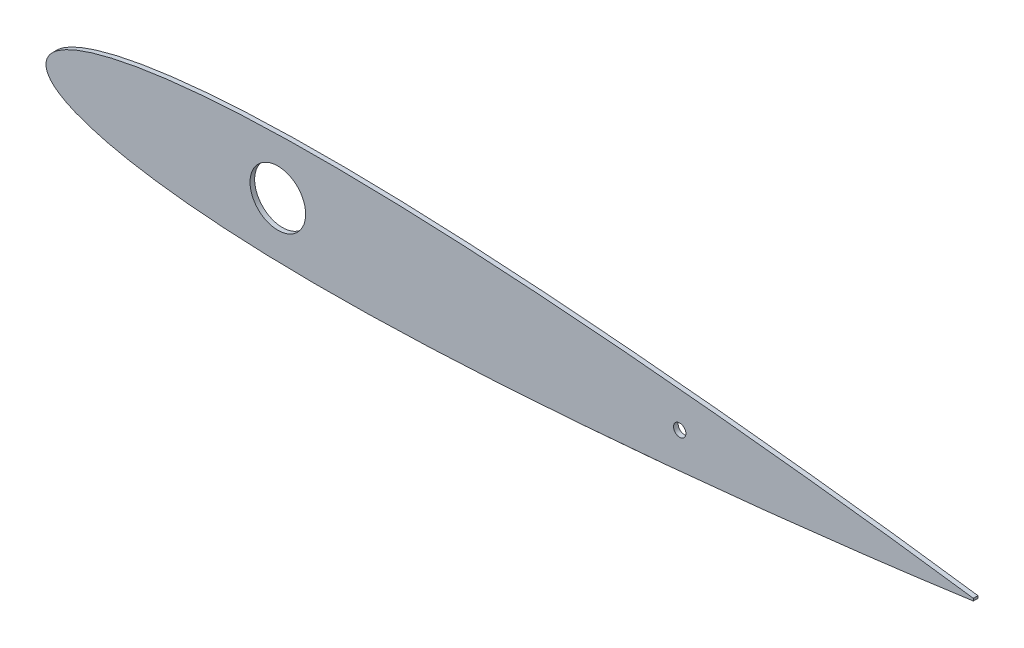
ISO-10303-21;
HEADER;
FILE_DESCRIPTION(('STEP AP214'),'2;1');
FILE_NAME('part.step','',(''),(''),'','','');
FILE_SCHEMA(('AUTOMOTIVE_DESIGN { 1 0 10303 214 1 1 1 1 }'));
ENDSEC;
DATA;
#1=APPLICATION_CONTEXT('core data for automotive mechanical design processes');
#2=APPLICATION_PROTOCOL_DEFINITION('international standard','automotive_design',2000,#1);
#3=PRODUCT_CONTEXT('',#1,'mechanical');
#4=PRODUCT('Part','Part','',(#3));
#5=PRODUCT_RELATED_PRODUCT_CATEGORY('part','',(#4));
#6=PRODUCT_DEFINITION_FORMATION('','',#4);
#7=PRODUCT_DEFINITION_CONTEXT('part definition',#1,'design');
#8=PRODUCT_DEFINITION('design','',#6,#7);
#9=PRODUCT_DEFINITION_SHAPE('','',#8);
#10=(LENGTH_UNIT() NAMED_UNIT(*) SI_UNIT(.MILLI.,.METRE.));
#11=(NAMED_UNIT(*) PLANE_ANGLE_UNIT() SI_UNIT($,.RADIAN.));
#12=(NAMED_UNIT(*) SI_UNIT($,.STERADIAN.) SOLID_ANGLE_UNIT());
#13=UNCERTAINTY_MEASURE_WITH_UNIT(LENGTH_MEASURE(1.E-05),#10,'distance_accuracy_value','');
#14=(GEOMETRIC_REPRESENTATION_CONTEXT(3) GLOBAL_UNCERTAINTY_ASSIGNED_CONTEXT((#13)) GLOBAL_UNIT_ASSIGNED_CONTEXT((#10,
#11,#12)) REPRESENTATION_CONTEXT('',''));
#15=CARTESIAN_POINT('',(0.,0.,0.));
#16=DIRECTION('',(0.,0.,1.));
#17=DIRECTION('',(1.,0.,0.));
#18=AXIS2_PLACEMENT_3D('',#15,#16,#17);
#19=CARTESIAN_POINT('',(300.,0.378,1.5));
#20=CARTESIAN_POINT('',(299.270406423723,0.479445821702321,1.5));
#21=CARTESIAN_POINT('',(297.234667094079,0.762503753929655,1.5));
#22=CARTESIAN_POINT('',(293.659650160598,1.25767350567564,1.5));
#23=CARTESIAN_POINT('',(289.112411794917,1.87424244263317,1.5));
#24=CARTESIAN_POINT('',(284.080816659039,2.54451744035542,1.5));
#25=CARTESIAN_POINT('',(278.752044218457,3.23812231587756,1.5));
#26=CARTESIAN_POINT('',(273.265899022492,3.93494643569603,1.5));
#27=CARTESIAN_POINT('',(267.705955472008,4.62901994283452,1.5));
#28=CARTESIAN_POINT('',(262.114563019878,5.31306910693868,1.5));
#29=CARTESIAN_POINT('',(256.508348909458,5.98219181245687,1.5));
#30=CARTESIAN_POINT('',(250.891738994323,6.63799080906206,1.5));
#31=CARTESIAN_POINT('',(245.269556965141,7.28177923500822,1.5));
#32=CARTESIAN_POINT('',(239.647345348642,7.91223276352409,1.5));
#33=CARTESIAN_POINT('',(234.025130106878,8.52699204615673,1.5));
#34=CARTESIAN_POINT('',(228.399087902931,9.12622976388424,1.5));
#35=CARTESIAN_POINT('',(222.76825764507,9.71307760610579,1.5));
#36=CARTESIAN_POINT('',(217.135920793231,10.2874598097057,1.5));
#37=CARTESIAN_POINT('',(211.505410154051,10.8469410839575,1.5));
#38=CARTESIAN_POINT('',(205.877619803237,11.3916428267252,1.5));
#39=CARTESIAN_POINT('',(200.251512373849,11.9208846239163,1.5));
#40=CARTESIAN_POINT('',(194.626420536409,12.4346170780367,1.5));
#41=CARTESIAN_POINT('',(189.002797137157,12.9319118094686,1.5));
#42=CARTESIAN_POINT('',(183.381530937822,13.4130975813696,1.5));
#43=CARTESIAN_POINT('',(177.763225616091,13.8763767009773,1.5));
#44=CARTESIAN_POINT('',(172.148301533052,14.3212371935345,1.5));
#45=CARTESIAN_POINT('',(166.537529461529,14.7478209184035,1.5));
#46=CARTESIAN_POINT('',(160.931736194082,15.1542281440202,1.5));
#47=CARTESIAN_POINT('',(155.331708850266,15.5391008558727,1.5));
#48=CARTESIAN_POINT('',(149.737538344952,15.9026495636587,1.5));
#49=CARTESIAN_POINT('',(144.148688279318,16.241846118568,1.5));
#50=CARTESIAN_POINT('',(138.565679604284,16.5574205464223,1.5));
#51=CARTESIAN_POINT('',(132.990859803018,16.8473975552547,1.5));
#52=CARTESIAN_POINT('',(127.427439440236,17.1102116785312,1.5));
#53=CARTESIAN_POINT('',(121.877619637439,17.3438917175145,1.5));
#54=CARTESIAN_POINT('',(116.340758577333,17.5452568128182,1.5));
#55=CARTESIAN_POINT('',(110.815476382379,17.712679119923,1.5));
#56=CARTESIAN_POINT('',(105.301273398415,17.8444979379819,1.5));
#57=CARTESIAN_POINT('',(99.8005701155126,17.9400918128776,1.5));
#58=CARTESIAN_POINT('',(94.3174358437247,17.9965904385618,1.5));
#59=CARTESIAN_POINT('',(88.8557640671298,18.0101244579531,1.5));
#60=CARTESIAN_POINT('',(83.4186479748791,17.9792338403315,1.5));
#61=CARTESIAN_POINT('',(78.0084808270908,17.8991607130085,1.5));
#62=CARTESIAN_POINT('',(72.6284553647751,17.7670337872511,1.5));
#63=CARTESIAN_POINT('',(67.2827387457577,17.5794139337101,1.5));
#64=CARTESIAN_POINT('',(61.9773648945375,17.331515488689,1.5));
#65=CARTESIAN_POINT('',(56.7206910156783,17.0210326511062,1.5));
#66=CARTESIAN_POINT('',(51.5251753215055,16.6409580698619,1.5));
#67=CARTESIAN_POINT('',(46.4082026187076,16.1901885907441,1.5));
#68=CARTESIAN_POINT('',(41.3941760651905,15.6616690993154,1.5));
#69=CARTESIAN_POINT('',(36.5156710865437,15.0539637839737,1.5));
#70=CARTESIAN_POINT('',(31.8190094409283,14.3656236049764,1.5));
#71=CARTESIAN_POINT('',(27.3661648285309,13.6034756838757,1.5));
#72=CARTESIAN_POINT('',(23.2352179540624,12.7825834438859,1.5));
#73=CARTESIAN_POINT('',(19.5026424507863,11.9202507512816,1.5));
#74=CARTESIAN_POINT('',(16.2182713927649,11.0445977962822,1.5));
#75=CARTESIAN_POINT('',(13.3891860155784,10.1750762553965,1.5));
#76=CARTESIAN_POINT('',(10.9849293334544,9.33349871540906,1.5));
#77=CARTESIAN_POINT('',(8.96156147750924,8.52206288153796,1.5));
#78=CARTESIAN_POINT('',(7.26729205281864,7.74697600174495,1.5));
#79=CARTESIAN_POINT('',(5.84605246563954,7.01062562176008,1.5));
#80=CARTESIAN_POINT('',(4.64771108498271,6.30063403293287,1.5));
#81=CARTESIAN_POINT('',(3.62823525123192,5.60651366797511,1.5));
#82=CARTESIAN_POINT('',(2.75190919699738,4.92663525162572,1.5));
#83=CARTESIAN_POINT('',(2.0062573601689,4.24991725904032,1.5));
#84=CARTESIAN_POINT('',(1.39058613668709,3.570259491991,1.5));
#85=CARTESIAN_POINT('',(0.901000434809516,2.89094225228363,1.5));
#86=CARTESIAN_POINT('',(0.529275534924718,2.22021927340558,1.5));
#87=CARTESIAN_POINT('',(0.260479536936117,1.56645893590234,1.5));
#88=CARTESIAN_POINT('',(0.0857126538537306,0.931035928118987,1.5));
#89=CARTESIAN_POINT('',(-0.00350924718492415,0.308981014512189,1.5));
#90=CARTESIAN_POINT('',(-0.00350924718492199,-0.308981014512209,1.5));
#91=CARTESIAN_POINT('',(0.0857126538537279,-0.931035928118965,1.5));
#92=CARTESIAN_POINT('',(0.260479536936107,-1.56645893590232,1.5));
#93=CARTESIAN_POINT('',(0.529275534924743,-2.2202192734056,1.5));
#94=CARTESIAN_POINT('',(0.901000434809474,-2.89094225228368,1.5));
#95=CARTESIAN_POINT('',(1.39058613668717,-3.57025949199063,1.5));
#96=CARTESIAN_POINT('',(2.00625736016862,-4.24991725904197,1.5));
#97=CARTESIAN_POINT('',(2.75190919699857,-4.92663525161857,1.5));
#98=CARTESIAN_POINT('',(3.62823525122678,-5.60651366800603,1.5));
#99=CARTESIAN_POINT('',(4.6477110850053,-6.3006340327972,1.5));
#100=CARTESIAN_POINT('',(5.84605246553727,-7.01062562237321,1.5));
#101=CARTESIAN_POINT('',(7.26729205329404,-7.74697599889616,1.5));
#102=CARTESIAN_POINT('',(8.96156147525896,-8.5220628950217,1.5));
#103=CARTESIAN_POINT('',(10.9849293441544,-9.33349865129378,1.5));
#104=CARTESIAN_POINT('',(13.3891859649807,-10.1750765585832,1.5));
#105=CARTESIAN_POINT('',(16.218271629693,-11.0445963765829,1.5));
#106=CARTESIAN_POINT('',(19.5026413612413,-11.9202572799561,1.5));
#107=CARTESIAN_POINT('',(23.2352227989104,-12.78255441302,1.5));
#108=CARTESIAN_POINT('',(27.3661275586072,-13.6035961608478,1.5));
#109=CARTESIAN_POINT('',(31.8190750083372,-14.3651133634918,1.5));
#110=CARTESIAN_POINT('',(36.5156346373272,-15.0541060972868,1.5));
#111=CARTESIAN_POINT('',(41.3941822041013,-15.6616288870965,1.5));
#112=CARTESIAN_POINT('',(46.4082009236496,-16.1901996940233,1.5));
#113=CARTESIAN_POINT('',(51.5251757859908,-16.6409550273053,1.5));
#114=CARTESIAN_POINT('',(56.7206908890808,-17.0210334803687,1.5));
#115=CARTESIAN_POINT('',(61.9773649289189,-17.3315152634777,1.5));
#116=CARTESIAN_POINT('',(67.2827387364428,-17.5794139947263,1.5));
#117=CARTESIAN_POINT('',(72.6284553672946,-17.767033770747,1.5));
#118=CARTESIAN_POINT('',(78.0084808264101,-17.8991607174675,1.5));
#119=CARTESIAN_POINT('',(83.4186479750628,-17.9792338391277,1.5));
#120=CARTESIAN_POINT('',(88.8557640670803,-18.0101244582778,1.5));
#121=CARTESIAN_POINT('',(94.317435843738,-17.9965904384742,1.5));
#122=CARTESIAN_POINT('',(99.8005701155091,-17.9400918129012,1.5));
#123=CARTESIAN_POINT('',(105.301273398416,-17.8444979379756,1.5));
#124=CARTESIAN_POINT('',(110.815476382379,-17.7126791199247,1.5));
#125=CARTESIAN_POINT('',(116.340758577333,-17.5452568128177,1.5));
#126=CARTESIAN_POINT('',(121.877619637439,-17.3438917175146,1.5));
#127=CARTESIAN_POINT('',(127.427439440236,-17.1102116785312,1.5));
#128=CARTESIAN_POINT('',(132.990859803018,-16.8473975552547,1.5));
#129=CARTESIAN_POINT('',(138.565679604284,-16.5574205464223,1.5));
#130=CARTESIAN_POINT('',(144.148688279318,-16.241846118568,1.5));
#131=CARTESIAN_POINT('',(149.737538344952,-15.9026495636587,1.5));
#132=CARTESIAN_POINT('',(155.331708850266,-15.5391008558727,1.5));
#133=CARTESIAN_POINT('',(160.931736194082,-15.1542281440202,1.5));
#134=CARTESIAN_POINT('',(166.537529461529,-14.7478209184035,1.5));
#135=CARTESIAN_POINT('',(172.148301533052,-14.3212371935345,1.5));
#136=CARTESIAN_POINT('',(177.763225616091,-13.8763767009773,1.5));
#137=CARTESIAN_POINT('',(183.381530937822,-13.4130975813696,1.5));
#138=CARTESIAN_POINT('',(189.002797137156,-12.9319118094686,1.5));
#139=CARTESIAN_POINT('',(194.626420536409,-12.4346170780367,1.5));
#140=CARTESIAN_POINT('',(200.251512373849,-11.9208846239163,1.5));
#141=CARTESIAN_POINT('',(205.877619803237,-11.3916428267251,1.5));
#142=CARTESIAN_POINT('',(211.505410154051,-10.8469410839575,1.5));
#143=CARTESIAN_POINT('',(217.135920793231,-10.2874598097057,1.5));
#144=CARTESIAN_POINT('',(222.76825764507,-9.71307760610578,1.5));
#145=CARTESIAN_POINT('',(228.399087902931,-9.12622976388424,1.5));
#146=CARTESIAN_POINT('',(234.025130106878,-8.52699204615673,1.5));
#147=CARTESIAN_POINT('',(239.647345348642,-7.91223276352409,1.5));
#148=CARTESIAN_POINT('',(245.269556965141,-7.28177923500822,1.5));
#149=CARTESIAN_POINT('',(250.891738994323,-6.63799080906206,1.5));
#150=CARTESIAN_POINT('',(256.508348909458,-5.98219181245686,1.5));
#151=CARTESIAN_POINT('',(262.114563019878,-5.31306910693868,1.5));
#152=CARTESIAN_POINT('',(267.705955472008,-4.62901994283452,1.5));
#153=CARTESIAN_POINT('',(273.265899022492,-3.93494643569603,1.5));
#154=CARTESIAN_POINT('',(278.752044218457,-3.23812231587756,1.5));
#155=CARTESIAN_POINT('',(284.080816659039,-2.54451744035542,1.5));
#156=CARTESIAN_POINT('',(289.112411794917,-1.87424244263317,1.5));
#157=CARTESIAN_POINT('',(293.659650160598,-1.25767350567564,1.5));
#158=CARTESIAN_POINT('',(297.234667094079,-0.76250375392966,1.5));
#159=CARTESIAN_POINT('',(299.270406423723,-0.479445821702321,1.5));
#160=CARTESIAN_POINT('',(300.,-0.378,1.5));
#161=B_SPLINE_CURVE_WITH_KNOTS('',3,(#19,#20,#21,#22,#23,#24,#25,#26,#27,#28,#29,#30,#31,#32,
#33,#34,#35,#36,#37,#38,#39,#40,#41,#42,#43,#44,#45,#46,#47,#48,#49,#50,#51,#52,#53,#54,#55,#56,
#57,#58,#59,#60,#61,#62,#63,#64,#65,#66,#67,#68,#69,#70,#71,#72,#73,#74,#75,#76,#77,#78,#79,#80,
#81,#82,#83,#84,#85,#86,#87,#88,#89,#90,#91,#92,#93,#94,#95,#96,#97,#98,#99,#100,#101,#102,#103,
#104,#105,#106,#107,#108,#109,#110,#111,#112,#113,#114,#115,#116,#117,#118,#119,#120,#121,#122,
#123,#124,#125,#126,#127,#128,#129,#130,#131,#132,#133,#134,#135,#136,#137,#138,#139,#140,#141,
#142,#143,#144,#145,#146,#147,#148,#149,#150,#151,#152,#153,#154,#155,#156,#157,#158,#159,#160),
.UNSPECIFIED.,.F.,.F.,(4,1,1,1,1,1,1,1,1,1,1,1,1,1,1,1,1,1,1,1,1,1,1,1,1,1,1,1,1,1,1,1,1,1,1,1,
1,1,1,1,1,1,1,1,1,1,1,1,1,1,1,1,1,1,1,1,1,1,1,1,1,1,1,1,1,1,1,1,1,1,1,1,1,1,1,1,1,1,1,1,1,1,1,1,
1,1,1,1,1,1,1,1,1,1,1,1,1,1,1,1,1,1,1,1,1,1,1,1,1,1,1,1,1,1,1,1,1,1,1,1,1,1,1,1,1,1,1,1,1,1,1,1,
1,1,1,1,1,1,1,4),(0.,0.00361222059404388,0.0100789532278554,0.0176986181570895,
0.0261151107220122,0.0349709660638799,0.0440503796486832,0.0532343297369713,0.0624475697827881,
0.0716739929600303,0.0809213185094618,0.0901775382979332,0.0994243421366575,0.108664440992277,
0.117912199004999,0.127169502180609,0.136426594565023,0.145675425736823,0.154916495397513,
0.164153236916375,0.173386648526191,0.182615736180586,0.191838089492061,0.201053134496137,
0.210260392550908,0.219458942389608,0.228646746886173,0.237822316287067,0.24698522413025,
0.25613738364592,0.265279415916296,0.274406949966901,0.283512193452554,0.292591781113348,
0.30164628535433,0.310681792653752,0.31969906757785,0.32869451957993,0.337660159695399,
0.346588583205171,0.355477411634764,0.364322937295264,0.373121613643215,0.381867635356829,
0.390553004884712,0.399166025869356,0.407689628257838,0.416098119030288,0.424354887451602,
0.432412428746428,0.440204728485537,0.447630505181733,0.454563637698397,0.460855379429517,
0.466413319364109,0.471228610451128,0.475365774282038,0.478901259753558,0.481915077255184,
0.484498871900912,0.486747127386087,0.488741251833575,0.490543179252672,0.492182103901344,
0.493672830547239,0.495031907807012,0.496279059618418,0.497424736506128,0.498490165528455,
0.499502757789975,0.500497253863142,0.501509846124661,0.502575275146988,0.503720952034698,
0.504968103846104,0.506327181105877,0.507817907751772,0.509456832400444,0.511258759819541,
0.51325288426703,0.515501139752205,0.518084934397933,0.521098751899559,0.524634237371078,
0.528771401201989,0.533586692289008,0.539144632223599,0.545436373954719,0.552369506471383,
0.559795200118754,0.567587571253572,0.575645112548398,0.583901880969712,0.592310371742162,
0.600833974130644,0.609446995115288,0.618132364643171,0.626878386356785,0.635677062704736,
0.644522588365236,0.653411416794829,0.662339840304601,0.67130548042007,0.68030093242215,
0.689318207346248,0.69835371464567,0.707408218886652,0.716487806547446,0.725593050033099,
0.734720584083704,0.74386261635408,0.75301477586975,0.762177683712933,0.771353253113827,
0.780541057610392,0.789739607449093,0.798946865503863,0.808161910507939,0.817384263819414,
0.826613351473809,0.835846763083625,0.845083504602487,0.854324574263177,0.863573405434977,
0.872830497819391,0.882087800995001,0.891335559007723,0.900575657863343,0.909822461702067,
0.919078681490538,0.92832600703997,0.937552430217212,0.946765670263029,0.955949620351317,
0.96502903393612,0.973884889277988,0.982301381842911,0.989921046772145,0.996387779405956,1.),.UNSPECIFIED.);
#162=DIRECTION('',(0.,0.,-1.));
#163=VECTOR('',#162,1.);
#164=SURFACE_OF_LINEAR_EXTRUSION('',#161,#163);
#165=CARTESIAN_POINT('',(300.,0.378,0.));
#166=CARTESIAN_POINT('',(299.270406423723,0.479445821702321,0.));
#167=CARTESIAN_POINT('',(297.234667094079,0.762503753929655,0.));
#168=CARTESIAN_POINT('',(293.659650160598,1.25767350567564,0.));
#169=CARTESIAN_POINT('',(289.112411794917,1.87424244263317,0.));
#170=CARTESIAN_POINT('',(284.080816659039,2.54451744035542,0.));
#171=CARTESIAN_POINT('',(278.752044218457,3.23812231587756,0.));
#172=CARTESIAN_POINT('',(273.265899022492,3.93494643569603,0.));
#173=CARTESIAN_POINT('',(267.705955472008,4.62901994283452,0.));
#174=CARTESIAN_POINT('',(262.114563019878,5.31306910693868,0.));
#175=CARTESIAN_POINT('',(256.508348909458,5.98219181245687,0.));
#176=CARTESIAN_POINT('',(250.891738994323,6.63799080906206,0.));
#177=CARTESIAN_POINT('',(245.269556965141,7.28177923500822,0.));
#178=CARTESIAN_POINT('',(239.647345348642,7.91223276352409,0.));
#179=CARTESIAN_POINT('',(234.025130106878,8.52699204615673,0.));
#180=CARTESIAN_POINT('',(228.399087902931,9.12622976388424,0.));
#181=CARTESIAN_POINT('',(222.76825764507,9.71307760610579,0.));
#182=CARTESIAN_POINT('',(217.135920793231,10.2874598097057,0.));
#183=CARTESIAN_POINT('',(211.505410154051,10.8469410839575,0.));
#184=CARTESIAN_POINT('',(205.877619803237,11.3916428267252,0.));
#185=CARTESIAN_POINT('',(200.251512373849,11.9208846239163,0.));
#186=CARTESIAN_POINT('',(194.626420536409,12.4346170780367,0.));
#187=CARTESIAN_POINT('',(189.002797137157,12.9319118094686,0.));
#188=CARTESIAN_POINT('',(183.381530937822,13.4130975813696,0.));
#189=CARTESIAN_POINT('',(177.763225616091,13.8763767009773,0.));
#190=CARTESIAN_POINT('',(172.148301533052,14.3212371935345,0.));
#191=CARTESIAN_POINT('',(166.537529461529,14.7478209184035,0.));
#192=CARTESIAN_POINT('',(160.931736194082,15.1542281440202,0.));
#193=CARTESIAN_POINT('',(155.331708850266,15.5391008558727,0.));
#194=CARTESIAN_POINT('',(149.737538344952,15.9026495636587,0.));
#195=CARTESIAN_POINT('',(144.148688279318,16.241846118568,0.));
#196=CARTESIAN_POINT('',(138.565679604284,16.5574205464223,0.));
#197=CARTESIAN_POINT('',(132.990859803018,16.8473975552547,0.));
#198=CARTESIAN_POINT('',(127.427439440236,17.1102116785312,0.));
#199=CARTESIAN_POINT('',(121.877619637439,17.3438917175145,0.));
#200=CARTESIAN_POINT('',(116.340758577333,17.5452568128182,0.));
#201=CARTESIAN_POINT('',(110.815476382379,17.712679119923,0.));
#202=CARTESIAN_POINT('',(105.301273398415,17.8444979379819,0.));
#203=CARTESIAN_POINT('',(99.8005701155126,17.9400918128776,0.));
#204=CARTESIAN_POINT('',(94.3174358437247,17.9965904385618,0.));
#205=CARTESIAN_POINT('',(88.8557640671298,18.0101244579531,0.));
#206=CARTESIAN_POINT('',(83.4186479748791,17.9792338403315,0.));
#207=CARTESIAN_POINT('',(78.0084808270908,17.8991607130085,0.));
#208=CARTESIAN_POINT('',(72.6284553647751,17.7670337872511,0.));
#209=CARTESIAN_POINT('',(67.2827387457577,17.5794139337101,0.));
#210=CARTESIAN_POINT('',(61.9773648945375,17.331515488689,0.));
#211=CARTESIAN_POINT('',(56.7206910156783,17.0210326511062,0.));
#212=CARTESIAN_POINT('',(51.5251753215055,16.6409580698619,0.));
#213=CARTESIAN_POINT('',(46.4082026187076,16.1901885907441,0.));
#214=CARTESIAN_POINT('',(41.3941760651905,15.6616690993154,0.));
#215=CARTESIAN_POINT('',(36.5156710865437,15.0539637839737,0.));
#216=CARTESIAN_POINT('',(31.8190094409283,14.3656236049764,0.));
#217=CARTESIAN_POINT('',(27.3661648285309,13.6034756838757,0.));
#218=CARTESIAN_POINT('',(23.2352179540624,12.7825834438859,0.));
#219=CARTESIAN_POINT('',(19.5026424507863,11.9202507512816,0.));
#220=CARTESIAN_POINT('',(16.2182713927649,11.0445977962822,0.));
#221=CARTESIAN_POINT('',(13.3891860155784,10.1750762553965,0.));
#222=CARTESIAN_POINT('',(10.9849293334544,9.33349871540906,0.));
#223=CARTESIAN_POINT('',(8.96156147750924,8.52206288153796,0.));
#224=CARTESIAN_POINT('',(7.26729205281864,7.74697600174495,0.));
#225=CARTESIAN_POINT('',(5.84605246563954,7.01062562176008,0.));
#226=CARTESIAN_POINT('',(4.64771108498271,6.30063403293287,0.));
#227=CARTESIAN_POINT('',(3.62823525123192,5.60651366797511,0.));
#228=CARTESIAN_POINT('',(2.75190919699738,4.92663525162572,0.));
#229=CARTESIAN_POINT('',(2.0062573601689,4.24991725904032,0.));
#230=CARTESIAN_POINT('',(1.39058613668709,3.570259491991,0.));
#231=CARTESIAN_POINT('',(0.901000434809516,2.89094225228363,0.));
#232=CARTESIAN_POINT('',(0.529275534924718,2.22021927340558,0.));
#233=CARTESIAN_POINT('',(0.260479536936117,1.56645893590234,0.));
#234=CARTESIAN_POINT('',(0.0857126538537306,0.931035928118987,0.));
#235=CARTESIAN_POINT('',(-0.00350924718492415,0.308981014512189,0.));
#236=CARTESIAN_POINT('',(-0.00350924718492199,-0.308981014512209,0.));
#237=CARTESIAN_POINT('',(0.0857126538537279,-0.931035928118965,0.));
#238=CARTESIAN_POINT('',(0.260479536936107,-1.56645893590232,0.));
#239=CARTESIAN_POINT('',(0.529275534924743,-2.2202192734056,0.));
#240=CARTESIAN_POINT('',(0.901000434809474,-2.89094225228368,0.));
#241=CARTESIAN_POINT('',(1.39058613668717,-3.57025949199063,0.));
#242=CARTESIAN_POINT('',(2.00625736016862,-4.24991725904197,0.));
#243=CARTESIAN_POINT('',(2.75190919699857,-4.92663525161857,0.));
#244=CARTESIAN_POINT('',(3.62823525122678,-5.60651366800603,0.));
#245=CARTESIAN_POINT('',(4.6477110850053,-6.3006340327972,0.));
#246=CARTESIAN_POINT('',(5.84605246553727,-7.01062562237321,0.));
#247=CARTESIAN_POINT('',(7.26729205329404,-7.74697599889616,0.));
#248=CARTESIAN_POINT('',(8.96156147525896,-8.5220628950217,0.));
#249=CARTESIAN_POINT('',(10.9849293441544,-9.33349865129378,0.));
#250=CARTESIAN_POINT('',(13.3891859649807,-10.1750765585832,0.));
#251=CARTESIAN_POINT('',(16.218271629693,-11.0445963765829,0.));
#252=CARTESIAN_POINT('',(19.5026413612413,-11.9202572799561,0.));
#253=CARTESIAN_POINT('',(23.2352227989104,-12.78255441302,0.));
#254=CARTESIAN_POINT('',(27.3661275586072,-13.6035961608478,0.));
#255=CARTESIAN_POINT('',(31.8190750083372,-14.3651133634918,0.));
#256=CARTESIAN_POINT('',(36.5156346373272,-15.0541060972868,0.));
#257=CARTESIAN_POINT('',(41.3941822041013,-15.6616288870965,0.));
#258=CARTESIAN_POINT('',(46.4082009236496,-16.1901996940233,0.));
#259=CARTESIAN_POINT('',(51.5251757859908,-16.6409550273053,0.));
#260=CARTESIAN_POINT('',(56.7206908890808,-17.0210334803687,0.));
#261=CARTESIAN_POINT('',(61.9773649289189,-17.3315152634777,0.));
#262=CARTESIAN_POINT('',(67.2827387364428,-17.5794139947263,0.));
#263=CARTESIAN_POINT('',(72.6284553672946,-17.767033770747,0.));
#264=CARTESIAN_POINT('',(78.0084808264101,-17.8991607174675,0.));
#265=CARTESIAN_POINT('',(83.4186479750628,-17.9792338391277,0.));
#266=CARTESIAN_POINT('',(88.8557640670803,-18.0101244582778,0.));
#267=CARTESIAN_POINT('',(94.317435843738,-17.9965904384742,0.));
#268=CARTESIAN_POINT('',(99.8005701155091,-17.9400918129012,0.));
#269=CARTESIAN_POINT('',(105.301273398416,-17.8444979379756,0.));
#270=CARTESIAN_POINT('',(110.815476382379,-17.7126791199247,0.));
#271=CARTESIAN_POINT('',(116.340758577333,-17.5452568128177,0.));
#272=CARTESIAN_POINT('',(121.877619637439,-17.3438917175146,0.));
#273=CARTESIAN_POINT('',(127.427439440236,-17.1102116785312,0.));
#274=CARTESIAN_POINT('',(132.990859803018,-16.8473975552547,0.));
#275=CARTESIAN_POINT('',(138.565679604284,-16.5574205464223,0.));
#276=CARTESIAN_POINT('',(144.148688279318,-16.241846118568,0.));
#277=CARTESIAN_POINT('',(149.737538344952,-15.9026495636587,0.));
#278=CARTESIAN_POINT('',(155.331708850266,-15.5391008558727,0.));
#279=CARTESIAN_POINT('',(160.931736194082,-15.1542281440202,0.));
#280=CARTESIAN_POINT('',(166.537529461529,-14.7478209184035,0.));
#281=CARTESIAN_POINT('',(172.148301533052,-14.3212371935345,0.));
#282=CARTESIAN_POINT('',(177.763225616091,-13.8763767009773,0.));
#283=CARTESIAN_POINT('',(183.381530937822,-13.4130975813696,0.));
#284=CARTESIAN_POINT('',(189.002797137156,-12.9319118094686,0.));
#285=CARTESIAN_POINT('',(194.626420536409,-12.4346170780367,0.));
#286=CARTESIAN_POINT('',(200.251512373849,-11.9208846239163,0.));
#287=CARTESIAN_POINT('',(205.877619803237,-11.3916428267251,0.));
#288=CARTESIAN_POINT('',(211.505410154051,-10.8469410839575,0.));
#289=CARTESIAN_POINT('',(217.135920793231,-10.2874598097057,0.));
#290=CARTESIAN_POINT('',(222.76825764507,-9.71307760610578,0.));
#291=CARTESIAN_POINT('',(228.399087902931,-9.12622976388424,0.));
#292=CARTESIAN_POINT('',(234.025130106878,-8.52699204615673,0.));
#293=CARTESIAN_POINT('',(239.647345348642,-7.91223276352409,0.));
#294=CARTESIAN_POINT('',(245.269556965141,-7.28177923500822,0.));
#295=CARTESIAN_POINT('',(250.891738994323,-6.63799080906206,0.));
#296=CARTESIAN_POINT('',(256.508348909458,-5.98219181245686,0.));
#297=CARTESIAN_POINT('',(262.114563019878,-5.31306910693868,0.));
#298=CARTESIAN_POINT('',(267.705955472008,-4.62901994283452,0.));
#299=CARTESIAN_POINT('',(273.265899022492,-3.93494643569603,0.));
#300=CARTESIAN_POINT('',(278.752044218457,-3.23812231587756,0.));
#301=CARTESIAN_POINT('',(284.080816659039,-2.54451744035542,0.));
#302=CARTESIAN_POINT('',(289.112411794917,-1.87424244263317,0.));
#303=CARTESIAN_POINT('',(293.659650160598,-1.25767350567564,0.));
#304=CARTESIAN_POINT('',(297.234667094079,-0.76250375392966,0.));
#305=CARTESIAN_POINT('',(299.270406423723,-0.479445821702321,0.));
#306=CARTESIAN_POINT('',(300.,-0.378,0.));
#307=B_SPLINE_CURVE_WITH_KNOTS('',3,(#165,#166,#167,#168,#169,#170,#171,#172,#173,#174,#175,
#176,#177,#178,#179,#180,#181,#182,#183,#184,#185,#186,#187,#188,#189,#190,#191,#192,#193,#194,
#195,#196,#197,#198,#199,#200,#201,#202,#203,#204,#205,#206,#207,#208,#209,#210,#211,#212,#213,
#214,#215,#216,#217,#218,#219,#220,#221,#222,#223,#224,#225,#226,#227,#228,#229,#230,#231,#232,
#233,#234,#235,#236,#237,#238,#239,#240,#241,#242,#243,#244,#245,#246,#247,#248,#249,#250,#251,
#252,#253,#254,#255,#256,#257,#258,#259,#260,#261,#262,#263,#264,#265,#266,#267,#268,#269,#270,
#271,#272,#273,#274,#275,#276,#277,#278,#279,#280,#281,#282,#283,#284,#285,#286,#287,#288,#289,
#290,#291,#292,#293,#294,#295,#296,#297,#298,#299,#300,#301,#302,#303,#304,#305,#306),
.UNSPECIFIED.,.F.,.F.,(4,1,1,1,1,1,1,1,1,1,1,1,1,1,1,1,1,1,1,1,1,1,1,1,1,1,1,1,1,1,1,1,1,1,1,1,
1,1,1,1,1,1,1,1,1,1,1,1,1,1,1,1,1,1,1,1,1,1,1,1,1,1,1,1,1,1,1,1,1,1,1,1,1,1,1,1,1,1,1,1,1,1,1,1,
1,1,1,1,1,1,1,1,1,1,1,1,1,1,1,1,1,1,1,1,1,1,1,1,1,1,1,1,1,1,1,1,1,1,1,1,1,1,1,1,1,1,1,1,1,1,1,1,
1,1,1,1,1,1,1,4),(0.,0.00361222059404388,0.0100789532278554,0.0176986181570895,
0.0261151107220122,0.0349709660638799,0.0440503796486832,0.0532343297369713,0.0624475697827881,
0.0716739929600303,0.0809213185094618,0.0901775382979332,0.0994243421366575,0.108664440992277,
0.117912199004999,0.127169502180609,0.136426594565023,0.145675425736823,0.154916495397513,
0.164153236916375,0.173386648526191,0.182615736180586,0.191838089492061,0.201053134496137,
0.210260392550908,0.219458942389608,0.228646746886173,0.237822316287067,0.24698522413025,
0.25613738364592,0.265279415916296,0.274406949966901,0.283512193452554,0.292591781113348,
0.30164628535433,0.310681792653752,0.31969906757785,0.32869451957993,0.337660159695399,
0.346588583205171,0.355477411634764,0.364322937295264,0.373121613643215,0.381867635356829,
0.390553004884712,0.399166025869356,0.407689628257838,0.416098119030288,0.424354887451602,
0.432412428746428,0.440204728485537,0.447630505181733,0.454563637698397,0.460855379429517,
0.466413319364109,0.471228610451128,0.475365774282038,0.478901259753558,0.481915077255184,
0.484498871900912,0.486747127386087,0.488741251833575,0.490543179252672,0.492182103901344,
0.493672830547239,0.495031907807012,0.496279059618418,0.497424736506128,0.498490165528455,
0.499502757789975,0.500497253863142,0.501509846124661,0.502575275146988,0.503720952034698,
0.504968103846104,0.506327181105877,0.507817907751772,0.509456832400444,0.511258759819541,
0.51325288426703,0.515501139752205,0.518084934397933,0.521098751899559,0.524634237371078,
0.528771401201989,0.533586692289008,0.539144632223599,0.545436373954719,0.552369506471383,
0.559795200118754,0.567587571253572,0.575645112548398,0.583901880969712,0.592310371742162,
0.600833974130644,0.609446995115288,0.618132364643171,0.626878386356785,0.635677062704736,
0.644522588365236,0.653411416794829,0.662339840304601,0.67130548042007,0.68030093242215,
0.689318207346248,0.69835371464567,0.707408218886652,0.716487806547446,0.725593050033099,
0.734720584083704,0.74386261635408,0.75301477586975,0.762177683712933,0.771353253113827,
0.780541057610392,0.789739607449093,0.798946865503863,0.808161910507939,0.817384263819414,
0.826613351473809,0.835846763083625,0.845083504602487,0.854324574263177,0.863573405434977,
0.872830497819391,0.882087800995001,0.891335559007723,0.900575657863343,0.909822461702067,
0.919078681490538,0.92832600703997,0.937552430217212,0.946765670263029,0.955949620351317,
0.96502903393612,0.973884889277988,0.982301381842911,0.989921046772145,0.996387779405956,1.),.UNSPECIFIED.);
#308=CARTESIAN_POINT('',(300.,0.378,0.));
#309=VERTEX_POINT('',#308);
#310=CARTESIAN_POINT('',(300.,-0.378,0.));
#311=VERTEX_POINT('',#310);
#312=EDGE_CURVE('E65',#309,#311,#307,.T.);
#313=ORIENTED_EDGE('',*,*,#312,.T.);
#314=DIRECTION('',(0.,0.,-1.));
#315=VECTOR('',#314,1.);
#316=CARTESIAN_POINT('',(300.,-0.378,1.5));
#317=LINE('',#316,#315);
#318=CARTESIAN_POINT('',(300.,-0.378,1.5));
#319=VERTEX_POINT('',#318);
#320=EDGE_CURVE('E11',#319,#311,#317,.T.);
#321=ORIENTED_EDGE('',*,*,#320,.F.);
#322=CARTESIAN_POINT('',(300.,0.378,1.5));
#323=VERTEX_POINT('',#322);
#324=EDGE_CURVE('E64',#323,#319,#161,.T.);
#325=ORIENTED_EDGE('',*,*,#324,.F.);
#326=DIRECTION('',(0.,0.,-1.));
#327=VECTOR('',#326,1.);
#328=CARTESIAN_POINT('',(300.,0.378,1.5));
#329=LINE('',#328,#327);
#330=EDGE_CURVE('E42',#323,#309,#329,.T.);
#331=ORIENTED_EDGE('',*,*,#330,.T.);
#332=EDGE_LOOP('',(#313,#321,#325,#331));
#333=FACE_BOUND('',#332,.T.);
#334=ADVANCED_FACE('F33',(#333),#164,.F.);
#335=CARTESIAN_POINT('',(300.,0.378,1.5));
#336=DIRECTION('',(-1.,0.,0.));
#337=DIRECTION('',(0.,0.,1.));
#338=AXIS2_PLACEMENT_3D('',#335,#336,#337);
#339=PLANE('',#338);
#340=DIRECTION('',(0.,1.,0.));
#341=VECTOR('',#340,1.);
#342=CARTESIAN_POINT('',(300.,0.378,0.));
#343=LINE('',#342,#341);
#344=EDGE_CURVE('E57',#311,#309,#343,.T.);
#345=ORIENTED_EDGE('',*,*,#344,.T.);
#346=ORIENTED_EDGE('',*,*,#330,.F.);
#347=DIRECTION('',(0.,1.,0.));
#348=VECTOR('',#347,1.);
#349=CARTESIAN_POINT('',(300.,0.378,1.5));
#350=LINE('',#349,#348);
#351=EDGE_CURVE('E49',#319,#323,#350,.T.);
#352=ORIENTED_EDGE('',*,*,#351,.F.);
#353=ORIENTED_EDGE('',*,*,#320,.T.);
#354=EDGE_LOOP('',(#345,#346,#352,#353));
#355=FACE_BOUND('',#354,.T.);
#356=ADVANCED_FACE('F60',(#355),#339,.F.);
#357=CARTESIAN_POINT('',(6.8064612781216E-05,3.56765379046865E-06,1.5));
#358=DIRECTION('',(0.,0.,-1.));
#359=DIRECTION('',(-1.,0.,0.));
#360=AXIS2_PLACEMENT_3D('',#357,#358,#359);
#361=PLANE('',#360);
#362=CARTESIAN_POINT('',(205.,0.,1.5));
#363=DIRECTION('',(0.,0.,1.));
#364=DIRECTION('',(1.,0.,0.));
#365=AXIS2_PLACEMENT_3D('',#362,#363,#364);
#366=CIRCLE('',#365,2.);
#367=CARTESIAN_POINT('',(207.,0.,1.5));
#368=VERTEX_POINT('',#367);
#369=EDGE_CURVE('E88',#368,#368,#366,.T.);
#370=ORIENTED_EDGE('',*,*,#369,.F.);
#371=EDGE_LOOP('',(#370));
#372=FACE_BOUND('',#371,.T.);
#373=CARTESIAN_POINT('',(75.,0.,1.5));
#374=DIRECTION('',(0.,0.,1.));
#375=DIRECTION('',(1.,0.,0.));
#376=AXIS2_PLACEMENT_3D('',#373,#374,#375);
#377=CIRCLE('',#376,9.);
#378=CARTESIAN_POINT('',(84.,0.,1.5));
#379=VERTEX_POINT('',#378);
#380=EDGE_CURVE('E72',#379,#379,#377,.T.);
#381=ORIENTED_EDGE('',*,*,#380,.F.);
#382=EDGE_LOOP('',(#381));
#383=FACE_BOUND('',#382,.T.);
#384=ORIENTED_EDGE('',*,*,#324,.T.);
#385=ORIENTED_EDGE('',*,*,#351,.T.);
#386=EDGE_LOOP('',(#384,#385));
#387=FACE_BOUND('',#386,.T.);
#388=ADVANCED_FACE('F99',(#372,#383,#387),#361,.F.);
#389=CARTESIAN_POINT('',(6.8064612781216E-05,3.56765379046865E-06,0.));
#390=DIRECTION('',(0.,0.,-1.));
#391=DIRECTION('',(-1.,0.,0.));
#392=AXIS2_PLACEMENT_3D('',#389,#390,#391);
#393=PLANE('',#392);
#394=CARTESIAN_POINT('',(205.,0.,0.));
#395=DIRECTION('',(0.,0.,1.));
#396=DIRECTION('',(1.,0.,0.));
#397=AXIS2_PLACEMENT_3D('',#394,#395,#396);
#398=CIRCLE('',#397,2.);
#399=CARTESIAN_POINT('',(207.,0.,0.));
#400=VERTEX_POINT('',#399);
#401=EDGE_CURVE('E90',#400,#400,#398,.T.);
#402=ORIENTED_EDGE('',*,*,#401,.T.);
#403=EDGE_LOOP('',(#402));
#404=FACE_BOUND('',#403,.T.);
#405=CARTESIAN_POINT('',(75.,0.,0.));
#406=DIRECTION('',(0.,0.,1.));
#407=DIRECTION('',(1.,0.,0.));
#408=AXIS2_PLACEMENT_3D('',#405,#406,#407);
#409=CIRCLE('',#408,9.);
#410=CARTESIAN_POINT('',(84.,0.,0.));
#411=VERTEX_POINT('',#410);
#412=EDGE_CURVE('E69',#411,#411,#409,.T.);
#413=ORIENTED_EDGE('',*,*,#412,.T.);
#414=EDGE_LOOP('',(#413));
#415=FACE_BOUND('',#414,.T.);
#416=ORIENTED_EDGE('',*,*,#312,.F.);
#417=ORIENTED_EDGE('',*,*,#344,.F.);
#418=EDGE_LOOP('',(#416,#417));
#419=FACE_BOUND('',#418,.T.);
#420=ADVANCED_FACE('F68',(#404,#415,#419),#393,.T.);
#421=CARTESIAN_POINT('',(75.,0.,0.));
#422=DIRECTION('',(0.,0.,1.));
#423=DIRECTION('',(1.,0.,0.));
#424=AXIS2_PLACEMENT_3D('',#421,#422,#423);
#425=CYLINDRICAL_SURFACE('',#424,9.);
#426=ORIENTED_EDGE('',*,*,#412,.F.);
#427=EDGE_LOOP('',(#426));
#428=FACE_BOUND('',#427,.T.);
#429=ORIENTED_EDGE('',*,*,#380,.T.);
#430=EDGE_LOOP('',(#429));
#431=FACE_BOUND('',#430,.T.);
#432=ADVANCED_FACE('F105',(#428,#431),#425,.F.);
#433=CARTESIAN_POINT('',(205.,0.,1.5));
#434=DIRECTION('',(0.,0.,-1.));
#435=DIRECTION('',(-1.,0.,0.));
#436=AXIS2_PLACEMENT_3D('',#433,#434,#435);
#437=CYLINDRICAL_SURFACE('',#436,2.);
#438=ORIENTED_EDGE('',*,*,#369,.T.);
#439=EDGE_LOOP('',(#438));
#440=FACE_BOUND('',#439,.T.);
#441=ORIENTED_EDGE('',*,*,#401,.F.);
#442=EDGE_LOOP('',(#441));
#443=FACE_BOUND('',#442,.T.);
#444=ADVANCED_FACE('F96',(#440,#443),#437,.F.);
#445=CLOSED_SHELL('',(#334,#356,#388,#420,#432,#444));
#446=MANIFOLD_SOLID_BREP('B2',#445);
#447=ADVANCED_BREP_SHAPE_REPRESENTATION('',(#18,#446),#14);
#448=SHAPE_DEFINITION_REPRESENTATION(#9,#447);
ENDSEC;
END-ISO-10303-21;
